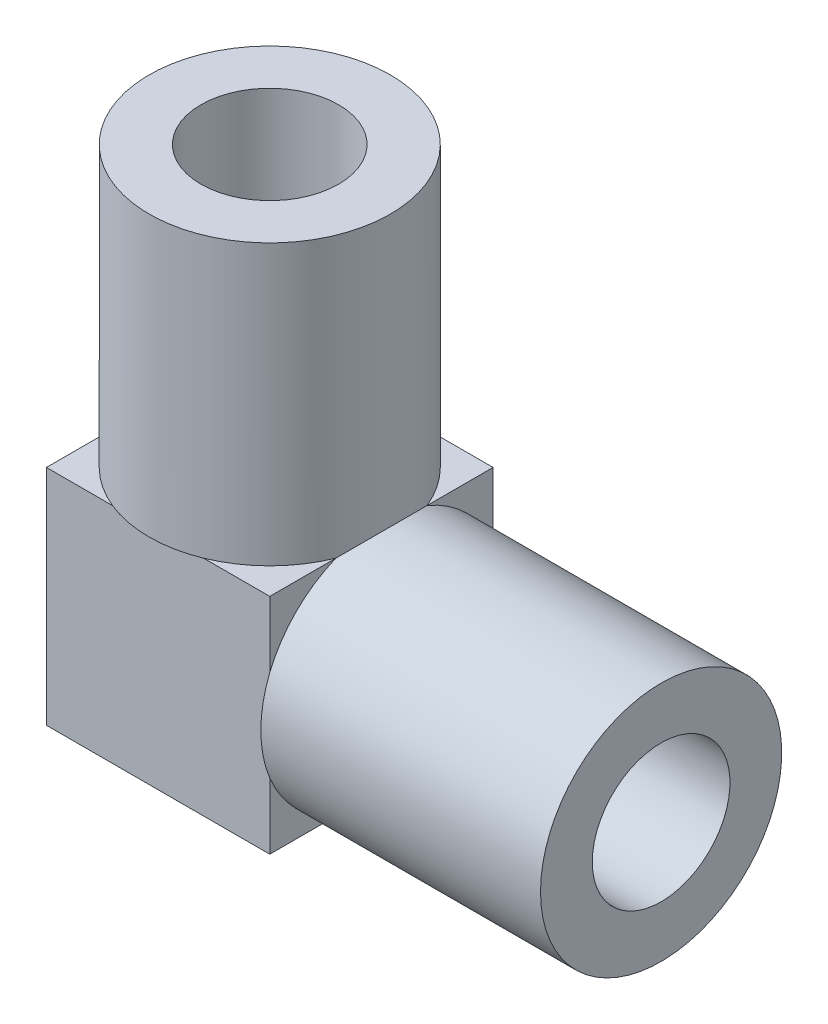
ISO-10303-21;
HEADER;
FILE_DESCRIPTION(('STEP AP214'),'2;1');
FILE_NAME('part.step','',(''),(''),'','','');
FILE_SCHEMA(('AUTOMOTIVE_DESIGN { 1 0 10303 214 1 1 1 1 }'));
ENDSEC;
DATA;
#1=APPLICATION_CONTEXT('core data for automotive mechanical design processes');
#2=APPLICATION_PROTOCOL_DEFINITION('international standard','automotive_design',2000,#1);
#3=PRODUCT_CONTEXT('',#1,'mechanical');
#4=PRODUCT('Part','Part','',(#3));
#5=PRODUCT_RELATED_PRODUCT_CATEGORY('part','',(#4));
#6=PRODUCT_DEFINITION_FORMATION('','',#4);
#7=PRODUCT_DEFINITION_CONTEXT('part definition',#1,'design');
#8=PRODUCT_DEFINITION('design','',#6,#7);
#9=PRODUCT_DEFINITION_SHAPE('','',#8);
#10=(LENGTH_UNIT() NAMED_UNIT(*) SI_UNIT(.MILLI.,.METRE.));
#11=(NAMED_UNIT(*) PLANE_ANGLE_UNIT() SI_UNIT($,.RADIAN.));
#12=(NAMED_UNIT(*) SI_UNIT($,.STERADIAN.) SOLID_ANGLE_UNIT());
#13=UNCERTAINTY_MEASURE_WITH_UNIT(LENGTH_MEASURE(1.E-05),#10,'distance_accuracy_value','');
#14=(GEOMETRIC_REPRESENTATION_CONTEXT(3) GLOBAL_UNCERTAINTY_ASSIGNED_CONTEXT((#13)) GLOBAL_UNIT_ASSIGNED_CONTEXT((#10,
#11,#12)) REPRESENTATION_CONTEXT('',''));
#15=CARTESIAN_POINT('',(0.,0.,0.));
#16=DIRECTION('',(0.,0.,1.));
#17=DIRECTION('',(1.,0.,0.));
#18=AXIS2_PLACEMENT_3D('',#15,#16,#17);
#19=CARTESIAN_POINT('',(10.3,10.3,10.3));
#20=DIRECTION('',(0.,-1.,0.));
#21=DIRECTION('',(0.,0.,-1.));
#22=AXIS2_PLACEMENT_3D('',#19,#20,#21);
#23=PLANE('',#22);
#24=DIRECTION('',(-1.,0.,0.));
#25=VECTOR('',#24,1.);
#26=CARTESIAN_POINT('',(10.3,10.3,-10.3));
#27=LINE('',#26,#25);
#28=CARTESIAN_POINT('',(10.3,10.3,-10.3));
#29=VERTEX_POINT('',#28);
#30=CARTESIAN_POINT('',(4.20159207920046,10.3,-10.3));
#31=VERTEX_POINT('',#30);
#32=EDGE_CURVE('E159',#29,#31,#27,.T.);
#33=ORIENTED_EDGE('',*,*,#32,.T.);
#34=CARTESIAN_POINT('',(0.,10.3,0.));
#35=DIRECTION('',(0.,-1.,0.));
#36=DIRECTION('',(0.,0.,-1.));
#37=AXIS2_PLACEMENT_3D('',#34,#35,#36);
#38=CIRCLE('',#37,11.124);
#39=CARTESIAN_POINT('',(10.3,10.3,-4.20159207920052));
#40=VERTEX_POINT('',#39);
#41=EDGE_CURVE('E150',#31,#40,#38,.T.);
#42=ORIENTED_EDGE('',*,*,#41,.T.);
#43=DIRECTION('',(0.,0.,-1.));
#44=VECTOR('',#43,1.);
#45=CARTESIAN_POINT('',(10.3,10.3,10.3));
#46=LINE('',#45,#44);
#47=EDGE_CURVE('E164',#40,#29,#46,.T.);
#48=ORIENTED_EDGE('',*,*,#47,.T.);
#49=EDGE_LOOP('',(#33,#42,#48));
#50=FACE_BOUND('',#49,.T.);
#51=ADVANCED_FACE('F41',(#50),#23,.F.);
#52=CARTESIAN_POINT('',(10.3,10.3,10.3));
#53=VERTEX_POINT('',#52);
#54=CARTESIAN_POINT('',(10.3,10.3,4.20159207920046));
#55=VERTEX_POINT('',#54);
#56=EDGE_CURVE('E179',#53,#55,#46,.T.);
#57=ORIENTED_EDGE('',*,*,#56,.T.);
#58=CARTESIAN_POINT('',(4.20159207920046,10.3,10.3));
#59=VERTEX_POINT('',#58);
#60=EDGE_CURVE('E153',#55,#59,#38,.T.);
#61=ORIENTED_EDGE('',*,*,#60,.T.);
#62=DIRECTION('',(-1.,0.,0.));
#63=VECTOR('',#62,1.);
#64=CARTESIAN_POINT('',(10.3,10.3,10.3));
#65=LINE('',#64,#63);
#66=EDGE_CURVE('E218',#53,#59,#65,.T.);
#67=ORIENTED_EDGE('',*,*,#66,.F.);
#68=EDGE_LOOP('',(#57,#61,#67));
#69=FACE_BOUND('',#68,.T.);
#70=ADVANCED_FACE('F270',(#69),#23,.F.);
#71=CARTESIAN_POINT('',(-4.20159207920046,10.3,10.3));
#72=VERTEX_POINT('',#71);
#73=CARTESIAN_POINT('',(-10.3,10.3,10.3));
#74=VERTEX_POINT('',#73);
#75=EDGE_CURVE('E69',#72,#74,#65,.T.);
#76=ORIENTED_EDGE('',*,*,#75,.F.);
#77=CARTESIAN_POINT('',(-10.3,10.3,4.20159207920046));
#78=VERTEX_POINT('',#77);
#79=EDGE_CURVE('E271',#72,#78,#38,.T.);
#80=ORIENTED_EDGE('',*,*,#79,.T.);
#81=DIRECTION('',(0.,0.,-1.));
#82=VECTOR('',#81,1.);
#83=CARTESIAN_POINT('',(-10.3,10.3,10.3));
#84=LINE('',#83,#82);
#85=EDGE_CURVE('E174',#74,#78,#84,.T.);
#86=ORIENTED_EDGE('',*,*,#85,.F.);
#87=EDGE_LOOP('',(#76,#80,#86));
#88=FACE_BOUND('',#87,.T.);
#89=ADVANCED_FACE('F299',(#88),#23,.F.);
#90=CARTESIAN_POINT('',(10.3,-10.3,10.3));
#91=DIRECTION('',(-1.,0.,0.));
#92=DIRECTION('',(0.,0.,1.));
#93=AXIS2_PLACEMENT_3D('',#90,#91,#92);
#94=PLANE('',#93);
#95=DIRECTION('',(0.,1.,0.));
#96=VECTOR('',#95,1.);
#97=CARTESIAN_POINT('',(10.3,-10.3,10.3));
#98=LINE('',#97,#96);
#99=CARTESIAN_POINT('',(10.3,4.20159207920046,10.3));
#100=VERTEX_POINT('',#99);
#101=EDGE_CURVE('E212',#100,#53,#98,.T.);
#102=ORIENTED_EDGE('',*,*,#101,.F.);
#103=CARTESIAN_POINT('',(10.3,0.,0.));
#104=DIRECTION('',(-1.,0.,0.));
#105=DIRECTION('',(0.,0.,1.));
#106=AXIS2_PLACEMENT_3D('',#103,#104,#105);
#107=CIRCLE('',#106,11.124);
#108=EDGE_CURVE('E202',#100,#55,#107,.T.);
#109=ORIENTED_EDGE('',*,*,#108,.T.);
#110=ORIENTED_EDGE('',*,*,#56,.F.);
#111=EDGE_LOOP('',(#102,#109,#110));
#112=FACE_BOUND('',#111,.T.);
#113=ADVANCED_FACE('F263',(#112),#94,.F.);
#114=ORIENTED_EDGE('',*,*,#47,.F.);
#115=CARTESIAN_POINT('',(10.3,4.20159207920046,-10.3));
#116=VERTEX_POINT('',#115);
#117=EDGE_CURVE('E49',#40,#116,#107,.T.);
#118=ORIENTED_EDGE('',*,*,#117,.T.);
#119=DIRECTION('',(0.,1.,0.));
#120=VECTOR('',#119,1.);
#121=CARTESIAN_POINT('',(10.3,-10.3,-10.3));
#122=LINE('',#121,#120);
#123=EDGE_CURVE('E221',#116,#29,#122,.T.);
#124=ORIENTED_EDGE('',*,*,#123,.T.);
#125=EDGE_LOOP('',(#114,#118,#124));
#126=FACE_BOUND('',#125,.T.);
#127=ADVANCED_FACE('F244',(#126),#94,.F.);
#128=CARTESIAN_POINT('',(10.3,-10.3,-10.3));
#129=VERTEX_POINT('',#128);
#130=CARTESIAN_POINT('',(10.3,-4.20159207920046,-10.3));
#131=VERTEX_POINT('',#130);
#132=EDGE_CURVE('E168',#129,#131,#122,.T.);
#133=ORIENTED_EDGE('',*,*,#132,.T.);
#134=CARTESIAN_POINT('',(10.3,-10.3,-4.20159207920046));
#135=VERTEX_POINT('',#134);
#136=EDGE_CURVE('E231',#131,#135,#107,.T.);
#137=ORIENTED_EDGE('',*,*,#136,.T.);
#138=DIRECTION('',(0.,0.,-1.));
#139=VECTOR('',#138,1.);
#140=CARTESIAN_POINT('',(10.3,-10.3,10.3));
#141=LINE('',#140,#139);
#142=EDGE_CURVE('E178',#135,#129,#141,.T.);
#143=ORIENTED_EDGE('',*,*,#142,.T.);
#144=EDGE_LOOP('',(#133,#137,#143));
#145=FACE_BOUND('',#144,.T.);
#146=ADVANCED_FACE('F235',(#145),#94,.F.);
#147=CARTESIAN_POINT('',(-10.3,10.3,10.3));
#148=DIRECTION('',(1.,0.,0.));
#149=DIRECTION('',(0.,0.,-1.));
#150=AXIS2_PLACEMENT_3D('',#147,#148,#149);
#151=PLANE('',#150);
#152=DIRECTION('',(0.,-1.,0.));
#153=VECTOR('',#152,1.);
#154=CARTESIAN_POINT('',(-10.3,10.3,-10.3));
#155=LINE('',#154,#153);
#156=CARTESIAN_POINT('',(-10.3,10.3,-10.3));
#157=VERTEX_POINT('',#156);
#158=CARTESIAN_POINT('',(-10.3,-10.3,-10.3));
#159=VERTEX_POINT('',#158);
#160=EDGE_CURVE('E211',#157,#159,#155,.T.);
#161=ORIENTED_EDGE('',*,*,#160,.T.);
#162=DIRECTION('',(0.,0.,-1.));
#163=VECTOR('',#162,1.);
#164=CARTESIAN_POINT('',(-10.3,-10.3,10.3));
#165=LINE('',#164,#163);
#166=CARTESIAN_POINT('',(-10.3,-10.3,10.3));
#167=VERTEX_POINT('',#166);
#168=EDGE_CURVE('E184',#167,#159,#165,.T.);
#169=ORIENTED_EDGE('',*,*,#168,.F.);
#170=DIRECTION('',(0.,-1.,0.));
#171=VECTOR('',#170,1.);
#172=CARTESIAN_POINT('',(-10.3,10.3,10.3));
#173=LINE('',#172,#171);
#174=EDGE_CURVE('E170',#74,#167,#173,.T.);
#175=ORIENTED_EDGE('',*,*,#174,.F.);
#176=ORIENTED_EDGE('',*,*,#85,.T.);
#177=DIRECTION('',(0.,0.,-1.));
#178=VECTOR('',#177,1.);
#179=CARTESIAN_POINT('',(-10.3,10.3,10.3));
#180=LINE('',#179,#178);
#181=CARTESIAN_POINT('',(-10.3,10.3,-4.20159207920046));
#182=VERTEX_POINT('',#181);
#183=EDGE_CURVE('E201',#78,#182,#180,.T.);
#184=ORIENTED_EDGE('',*,*,#183,.T.);
#185=EDGE_CURVE('E89',#182,#157,#84,.T.);
#186=ORIENTED_EDGE('',*,*,#185,.T.);
#187=EDGE_LOOP('',(#161,#169,#175,#176,#184,#186));
#188=FACE_BOUND('',#187,.T.);
#189=ADVANCED_FACE('F43',(#188),#151,.F.);
#190=CARTESIAN_POINT('',(-10.3,-10.3,10.3));
#191=DIRECTION('',(0.,1.,0.));
#192=DIRECTION('',(0.,0.,1.));
#193=AXIS2_PLACEMENT_3D('',#190,#191,#192);
#194=PLANE('',#193);
#195=DIRECTION('',(1.,0.,0.));
#196=VECTOR('',#195,1.);
#197=CARTESIAN_POINT('',(-10.3,-10.3,-10.3));
#198=LINE('',#197,#196);
#199=EDGE_CURVE('E225',#159,#129,#198,.T.);
#200=ORIENTED_EDGE('',*,*,#199,.T.);
#201=ORIENTED_EDGE('',*,*,#142,.F.);
#202=CARTESIAN_POINT('',(10.3,-10.3,4.20159207920046));
#203=VERTEX_POINT('',#202);
#204=EDGE_CURVE('E183',#203,#135,#141,.T.);
#205=ORIENTED_EDGE('',*,*,#204,.F.);
#206=CARTESIAN_POINT('',(10.3,-10.3,10.3));
#207=VERTEX_POINT('',#206);
#208=EDGE_CURVE('E182',#207,#203,#141,.T.);
#209=ORIENTED_EDGE('',*,*,#208,.F.);
#210=DIRECTION('',(1.,0.,0.));
#211=VECTOR('',#210,1.);
#212=CARTESIAN_POINT('',(-10.3,-10.3,10.3));
#213=LINE('',#212,#211);
#214=EDGE_CURVE('E98',#167,#207,#213,.T.);
#215=ORIENTED_EDGE('',*,*,#214,.F.);
#216=ORIENTED_EDGE('',*,*,#168,.T.);
#217=EDGE_LOOP('',(#200,#201,#205,#209,#215,#216));
#218=FACE_BOUND('',#217,.T.);
#219=ADVANCED_FACE('F254',(#218),#194,.F.);
#220=ORIENTED_EDGE('',*,*,#208,.T.);
#221=CARTESIAN_POINT('',(10.3,-4.20159207920046,10.3));
#222=VERTEX_POINT('',#221);
#223=EDGE_CURVE('E187',#203,#222,#107,.T.);
#224=ORIENTED_EDGE('',*,*,#223,.T.);
#225=EDGE_CURVE('E214',#207,#222,#98,.T.);
#226=ORIENTED_EDGE('',*,*,#225,.F.);
#227=EDGE_LOOP('',(#220,#224,#226));
#228=FACE_BOUND('',#227,.T.);
#229=ADVANCED_FACE('F250',(#228),#94,.F.);
#230=ORIENTED_EDGE('',*,*,#185,.F.);
#231=CARTESIAN_POINT('',(-4.20159207920046,10.3,-10.3));
#232=VERTEX_POINT('',#231);
#233=EDGE_CURVE('E145',#182,#232,#38,.T.);
#234=ORIENTED_EDGE('',*,*,#233,.T.);
#235=EDGE_CURVE('E161',#232,#157,#27,.T.);
#236=ORIENTED_EDGE('',*,*,#235,.T.);
#237=EDGE_LOOP('',(#230,#234,#236));
#238=FACE_BOUND('',#237,.T.);
#239=ADVANCED_FACE('F278',(#238),#23,.F.);
#240=CARTESIAN_POINT('',(0.,0.,10.3));
#241=DIRECTION('',(0.,0.,1.));
#242=DIRECTION('',(1.,0.,0.));
#243=AXIS2_PLACEMENT_3D('',#240,#241,#242);
#244=PLANE('',#243);
#245=ORIENTED_EDGE('',*,*,#174,.T.);
#246=ORIENTED_EDGE('',*,*,#214,.T.);
#247=ORIENTED_EDGE('',*,*,#225,.T.);
#248=EDGE_CURVE('E217',#222,#100,#98,.T.);
#249=ORIENTED_EDGE('',*,*,#248,.T.);
#250=ORIENTED_EDGE('',*,*,#101,.T.);
#251=ORIENTED_EDGE('',*,*,#66,.T.);
#252=DIRECTION('',(1.,0.,0.));
#253=VECTOR('',#252,1.);
#254=CARTESIAN_POINT('',(0.,10.3,10.3));
#255=LINE('',#254,#253);
#256=EDGE_CURVE('E165',#72,#59,#255,.T.);
#257=ORIENTED_EDGE('',*,*,#256,.F.);
#258=ORIENTED_EDGE('',*,*,#75,.T.);
#259=EDGE_LOOP('',(#245,#246,#247,#249,#250,#251,#257,#258));
#260=FACE_BOUND('',#259,.T.);
#261=ADVANCED_FACE('F253',(#260),#244,.T.);
#262=CARTESIAN_POINT('',(0.,0.,-10.3));
#263=DIRECTION('',(0.,0.,1.));
#264=DIRECTION('',(1.,0.,0.));
#265=AXIS2_PLACEMENT_3D('',#262,#263,#264);
#266=PLANE('',#265);
#267=ORIENTED_EDGE('',*,*,#160,.F.);
#268=ORIENTED_EDGE('',*,*,#235,.F.);
#269=DIRECTION('',(1.,0.,0.));
#270=VECTOR('',#269,1.);
#271=CARTESIAN_POINT('',(0.,10.3,-10.3));
#272=LINE('',#271,#270);
#273=EDGE_CURVE('E143',#232,#31,#272,.T.);
#274=ORIENTED_EDGE('',*,*,#273,.T.);
#275=ORIENTED_EDGE('',*,*,#32,.F.);
#276=ORIENTED_EDGE('',*,*,#123,.F.);
#277=EDGE_CURVE('E230',#131,#116,#122,.T.);
#278=ORIENTED_EDGE('',*,*,#277,.F.);
#279=ORIENTED_EDGE('',*,*,#132,.F.);
#280=ORIENTED_EDGE('',*,*,#199,.F.);
#281=EDGE_LOOP('',(#267,#268,#274,#275,#276,#278,#279,#280));
#282=FACE_BOUND('',#281,.T.);
#283=ADVANCED_FACE('F158',(#282),#266,.F.);
#284=CARTESIAN_POINT('',(10.3,11.124,0.));
#285=DIRECTION('',(1.,0.,0.));
#286=DIRECTION('',(0.,0.,-1.));
#287=AXIS2_PLACEMENT_3D('',#284,#285,#286);
#288=PLANE('',#287);
#289=EDGE_CURVE('E207',#116,#131,#107,.T.);
#290=ORIENTED_EDGE('',*,*,#289,.T.);
#291=ORIENTED_EDGE('',*,*,#277,.T.);
#292=EDGE_LOOP('',(#290,#291));
#293=FACE_BOUND('',#292,.T.);
#294=ADVANCED_FACE('F239',(#293),#288,.F.);
#295=EDGE_CURVE('E243',#135,#203,#107,.T.);
#296=ORIENTED_EDGE('',*,*,#295,.T.);
#297=ORIENTED_EDGE('',*,*,#204,.T.);
#298=EDGE_LOOP('',(#296,#297));
#299=FACE_BOUND('',#298,.T.);
#300=ADVANCED_FACE('F260',(#299),#288,.F.);
#301=ORIENTED_EDGE('',*,*,#248,.F.);
#302=EDGE_CURVE('E59',#222,#100,#107,.T.);
#303=ORIENTED_EDGE('',*,*,#302,.T.);
#304=EDGE_LOOP('',(#301,#303));
#305=FACE_BOUND('',#304,.T.);
#306=ADVANCED_FACE('F259',(#305),#288,.F.);
#307=CARTESIAN_POINT('',(36.1,0.,0.));
#308=DIRECTION('',(-1.,0.,0.));
#309=DIRECTION('',(0.,0.,1.));
#310=AXIS2_PLACEMENT_3D('',#307,#308,#309);
#311=PLANE('',#310);
#312=CARTESIAN_POINT('',(36.1,0.,0.));
#313=DIRECTION('',(-1.,0.,0.));
#314=DIRECTION('',(0.,0.,1.));
#315=AXIS2_PLACEMENT_3D('',#312,#313,#314);
#316=CIRCLE('',#315,6.35);
#317=CARTESIAN_POINT('',(36.1,0.,6.35));
#318=VERTEX_POINT('',#317);
#319=EDGE_CURVE('E190',#318,#318,#316,.F.);
#320=ORIENTED_EDGE('',*,*,#319,.F.);
#321=EDGE_LOOP('',(#320));
#322=FACE_BOUND('',#321,.T.);
#323=CARTESIAN_POINT('',(36.1,0.,0.));
#324=DIRECTION('',(-1.,0.,0.));
#325=DIRECTION('',(0.,0.,1.));
#326=AXIS2_PLACEMENT_3D('',#323,#324,#325);
#327=CIRCLE('',#326,11.124);
#328=CARTESIAN_POINT('',(36.1,0.,11.124));
#329=VERTEX_POINT('',#328);
#330=EDGE_CURVE('E208',#329,#329,#327,.T.);
#331=ORIENTED_EDGE('',*,*,#330,.F.);
#332=EDGE_LOOP('',(#331));
#333=FACE_BOUND('',#332,.T.);
#334=ADVANCED_FACE('F286',(#322,#333),#311,.F.);
#335=CARTESIAN_POINT('',(-1000.,0.,0.));
#336=DIRECTION('',(-1.,0.,0.));
#337=DIRECTION('',(0.,0.,1.));
#338=AXIS2_PLACEMENT_3D('',#335,#336,#337);
#339=CYLINDRICAL_SURFACE('',#338,11.124);
#340=ORIENTED_EDGE('',*,*,#117,.F.);
#341=CARTESIAN_POINT('',(0.,0.,0.));
#342=DIRECTION('',(-0.707106781186547,0.707106781186547,0.));
#343=DIRECTION('',(-0.707106781186547,-0.707106781186547,0.));
#344=AXIS2_PLACEMENT_3D('',#341,#342,#343);
#345=ELLIPSE('',#344,15.7317116678383,11.124);
#346=EDGE_CURVE('E11',#40,#55,#345,.F.);
#347=ORIENTED_EDGE('',*,*,#346,.T.);
#348=ORIENTED_EDGE('',*,*,#108,.F.);
#349=ORIENTED_EDGE('',*,*,#302,.F.);
#350=ORIENTED_EDGE('',*,*,#223,.F.);
#351=ORIENTED_EDGE('',*,*,#295,.F.);
#352=ORIENTED_EDGE('',*,*,#136,.F.);
#353=ORIENTED_EDGE('',*,*,#289,.F.);
#354=EDGE_LOOP('',(#340,#347,#348,#349,#350,#351,#352,#353));
#355=FACE_BOUND('',#354,.T.);
#356=ORIENTED_EDGE('',*,*,#330,.T.);
#357=EDGE_LOOP('',(#356));
#358=FACE_BOUND('',#357,.T.);
#359=ADVANCED_FACE('F238',(#355,#358),#339,.T.);
#360=CARTESIAN_POINT('',(0.,10.3,0.));
#361=DIRECTION('',(0.,-1.,0.));
#362=DIRECTION('',(0.,0.,-1.));
#363=AXIS2_PLACEMENT_3D('',#360,#361,#362);
#364=PLANE('',#363);
#365=ORIENTED_EDGE('',*,*,#183,.F.);
#366=EDGE_CURVE('E273',#78,#182,#38,.T.);
#367=ORIENTED_EDGE('',*,*,#366,.T.);
#368=EDGE_LOOP('',(#365,#367));
#369=FACE_BOUND('',#368,.T.);
#370=ADVANCED_FACE('F282',(#369),#364,.T.);
#371=ORIENTED_EDGE('',*,*,#273,.F.);
#372=EDGE_CURVE('E139',#232,#31,#38,.T.);
#373=ORIENTED_EDGE('',*,*,#372,.T.);
#374=EDGE_LOOP('',(#371,#373));
#375=FACE_BOUND('',#374,.T.);
#376=ADVANCED_FACE('F136',(#375),#364,.T.);
#377=EDGE_CURVE('E267',#59,#72,#38,.T.);
#378=ORIENTED_EDGE('',*,*,#377,.T.);
#379=ORIENTED_EDGE('',*,*,#256,.T.);
#380=EDGE_LOOP('',(#378,#379));
#381=FACE_BOUND('',#380,.T.);
#382=ADVANCED_FACE('F284',(#381),#364,.T.);
#383=CARTESIAN_POINT('',(0.,-500.,0.));
#384=DIRECTION('',(0.,-1.,0.));
#385=DIRECTION('',(0.,0.,-1.));
#386=AXIS2_PLACEMENT_3D('',#383,#384,#385);
#387=CYLINDRICAL_SURFACE('',#386,11.124);
#388=CARTESIAN_POINT('',(0.,36.1,0.));
#389=DIRECTION('',(0.,-1.,0.));
#390=DIRECTION('',(0.,0.,-1.));
#391=AXIS2_PLACEMENT_3D('',#388,#389,#390);
#392=CIRCLE('',#391,11.124);
#393=CARTESIAN_POINT('',(0.,36.1,-11.124));
#394=VERTEX_POINT('',#393);
#395=EDGE_CURVE('E144',#394,#394,#392,.T.);
#396=ORIENTED_EDGE('',*,*,#395,.T.);
#397=EDGE_LOOP('',(#396));
#398=FACE_BOUND('',#397,.T.);
#399=ORIENTED_EDGE('',*,*,#346,.F.);
#400=ORIENTED_EDGE('',*,*,#41,.F.);
#401=ORIENTED_EDGE('',*,*,#372,.F.);
#402=ORIENTED_EDGE('',*,*,#233,.F.);
#403=ORIENTED_EDGE('',*,*,#366,.F.);
#404=ORIENTED_EDGE('',*,*,#79,.F.);
#405=ORIENTED_EDGE('',*,*,#377,.F.);
#406=ORIENTED_EDGE('',*,*,#60,.F.);
#407=EDGE_LOOP('',(#399,#400,#401,#402,#403,#404,#405,#406));
#408=FACE_BOUND('',#407,.T.);
#409=ADVANCED_FACE('F149',(#398,#408),#387,.T.);
#410=CARTESIAN_POINT('',(11.124,36.1,0.));
#411=DIRECTION('',(0.,1.,0.));
#412=DIRECTION('',(0.,0.,1.));
#413=AXIS2_PLACEMENT_3D('',#410,#411,#412);
#414=PLANE('',#413);
#415=CARTESIAN_POINT('',(0.,36.1,0.));
#416=DIRECTION('',(0.,1.,0.));
#417=DIRECTION('',(0.,0.,1.));
#418=AXIS2_PLACEMENT_3D('',#415,#416,#417);
#419=CIRCLE('',#418,6.35);
#420=CARTESIAN_POINT('',(0.,36.1,6.35));
#421=VERTEX_POINT('',#420);
#422=EDGE_CURVE('E44',#421,#421,#419,.T.);
#423=ORIENTED_EDGE('',*,*,#422,.F.);
#424=EDGE_LOOP('',(#423));
#425=FACE_BOUND('',#424,.T.);
#426=ORIENTED_EDGE('',*,*,#395,.F.);
#427=EDGE_LOOP('',(#426));
#428=FACE_BOUND('',#427,.T.);
#429=ADVANCED_FACE('F404',(#425,#428),#414,.T.);
#430=CARTESIAN_POINT('',(-1000.,0.,0.));
#431=DIRECTION('',(-1.,0.,0.));
#432=DIRECTION('',(0.,0.,1.));
#433=AXIS2_PLACEMENT_3D('',#430,#431,#432);
#434=CYLINDRICAL_SURFACE('',#433,6.35);
#435=CARTESIAN_POINT('',(13.2000000000001,0.,0.));
#436=DIRECTION('',(-1.,0.,0.));
#437=DIRECTION('',(0.,0.,1.));
#438=AXIS2_PLACEMENT_3D('',#435,#436,#437);
#439=CIRCLE('',#438,6.35);
#440=CARTESIAN_POINT('',(13.2000000000001,0.,6.35));
#441=VERTEX_POINT('',#440);
#442=EDGE_CURVE('E189',#441,#441,#439,.T.);
#443=ORIENTED_EDGE('',*,*,#442,.T.);
#444=EDGE_LOOP('',(#443));
#445=FACE_BOUND('',#444,.T.);
#446=ORIENTED_EDGE('',*,*,#319,.T.);
#447=EDGE_LOOP('',(#446));
#448=FACE_BOUND('',#447,.T.);
#449=ADVANCED_FACE('F414',(#445,#448),#434,.F.);
#450=CARTESIAN_POINT('',(13.2,6.35,0.));
#451=DIRECTION('',(1.,0.,0.));
#452=DIRECTION('',(0.,0.,-1.));
#453=AXIS2_PLACEMENT_3D('',#450,#451,#452);
#454=PLANE('',#453);
#455=ORIENTED_EDGE('',*,*,#442,.F.);
#456=EDGE_LOOP('',(#455));
#457=FACE_BOUND('',#456,.T.);
#458=ADVANCED_FACE('F423',(#457),#454,.T.);
#459=CARTESIAN_POINT('',(0.,13.2,0.));
#460=DIRECTION('',(0.,-1.,0.));
#461=DIRECTION('',(0.,0.,-1.));
#462=AXIS2_PLACEMENT_3D('',#459,#460,#461);
#463=PLANE('',#462);
#464=CARTESIAN_POINT('',(0.,13.2,0.));
#465=DIRECTION('',(0.,-1.,0.));
#466=DIRECTION('',(0.,0.,-1.));
#467=AXIS2_PLACEMENT_3D('',#464,#465,#466);
#468=CIRCLE('',#467,6.35);
#469=CARTESIAN_POINT('',(0.,13.2,-6.35));
#470=VERTEX_POINT('',#469);
#471=EDGE_CURVE('E200',#470,#470,#468,.T.);
#472=ORIENTED_EDGE('',*,*,#471,.F.);
#473=EDGE_LOOP('',(#472));
#474=FACE_BOUND('',#473,.T.);
#475=ADVANCED_FACE('F427',(#474),#463,.F.);
#476=CARTESIAN_POINT('',(0.,-500.,0.));
#477=DIRECTION('',(0.,-1.,0.));
#478=DIRECTION('',(0.,0.,-1.));
#479=AXIS2_PLACEMENT_3D('',#476,#477,#478);
#480=CYLINDRICAL_SURFACE('',#479,6.35);
#481=ORIENTED_EDGE('',*,*,#422,.T.);
#482=EDGE_LOOP('',(#481));
#483=FACE_BOUND('',#482,.T.);
#484=ORIENTED_EDGE('',*,*,#471,.T.);
#485=EDGE_LOOP('',(#484));
#486=FACE_BOUND('',#485,.T.);
#487=ADVANCED_FACE('F437',(#483,#486),#480,.F.);
#488=CLOSED_SHELL('',(#51,#70,#89,#113,#127,#146,#189,#219,#229,#239,#261,#283,#294,#300,#306,
#334,#359,#370,#376,#382,#409,#429,#449,#458,#475,#487));
#489=MANIFOLD_SOLID_BREP('B2',#488);
#490=ADVANCED_BREP_SHAPE_REPRESENTATION('',(#18,#489),#14);
#491=SHAPE_DEFINITION_REPRESENTATION(#9,#490);
ENDSEC;
END-ISO-10303-21;
